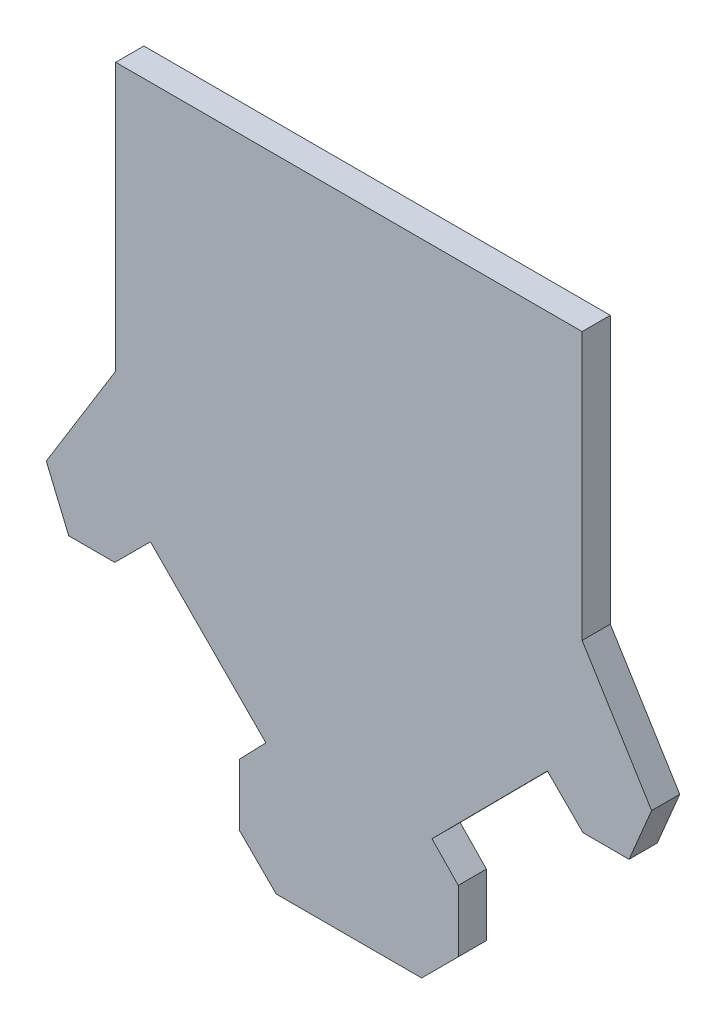
ISO-10303-21;
HEADER;
FILE_DESCRIPTION(('STEP AP214'),'2;1');
FILE_NAME('part.step','',(''),(''),'','','');
FILE_SCHEMA(('AUTOMOTIVE_DESIGN { 1 0 10303 214 1 1 1 1 }'));
ENDSEC;
DATA;
#1=APPLICATION_CONTEXT('core data for automotive mechanical design processes');
#2=APPLICATION_PROTOCOL_DEFINITION('international standard','automotive_design',2000,#1);
#3=PRODUCT_CONTEXT('',#1,'mechanical');
#4=PRODUCT('Part','Part','',(#3));
#5=PRODUCT_RELATED_PRODUCT_CATEGORY('part','',(#4));
#6=PRODUCT_DEFINITION_FORMATION('','',#4);
#7=PRODUCT_DEFINITION_CONTEXT('part definition',#1,'design');
#8=PRODUCT_DEFINITION('design','',#6,#7);
#9=PRODUCT_DEFINITION_SHAPE('','',#8);
#10=(LENGTH_UNIT() NAMED_UNIT(*) SI_UNIT(.MILLI.,.METRE.));
#11=(NAMED_UNIT(*) PLANE_ANGLE_UNIT() SI_UNIT($,.RADIAN.));
#12=(NAMED_UNIT(*) SI_UNIT($,.STERADIAN.) SOLID_ANGLE_UNIT());
#13=UNCERTAINTY_MEASURE_WITH_UNIT(LENGTH_MEASURE(1.E-05),#10,'distance_accuracy_value','');
#14=(GEOMETRIC_REPRESENTATION_CONTEXT(3) GLOBAL_UNCERTAINTY_ASSIGNED_CONTEXT((#13)) GLOBAL_UNIT_ASSIGNED_CONTEXT((#10,
#11,#12)) REPRESENTATION_CONTEXT('',''));
#15=CARTESIAN_POINT('',(0.,0.,0.));
#16=DIRECTION('',(0.,0.,1.));
#17=DIRECTION('',(1.,0.,0.));
#18=AXIS2_PLACEMENT_3D('',#15,#16,#17);
#19=CARTESIAN_POINT('',(49.7,-102.361198886854,3.));
#20=DIRECTION('',(1.,0.,0.));
#21=DIRECTION('',(0.,0.,-1.));
#22=AXIS2_PLACEMENT_3D('',#19,#20,#21);
#23=PLANE('',#22);
#24=DIRECTION('',(0.,-1.,0.));
#25=VECTOR('',#24,1.);
#26=CARTESIAN_POINT('',(49.7,-102.361198886854,0.));
#27=LINE('',#26,#25);
#28=CARTESIAN_POINT('',(49.7,0.,0.));
#29=VERTEX_POINT('',#28);
#30=CARTESIAN_POINT('',(49.7,-28.5,0.));
#31=VERTEX_POINT('',#30);
#32=EDGE_CURVE('E200',#29,#31,#27,.T.);
#33=ORIENTED_EDGE('',*,*,#32,.F.);
#34=DIRECTION('',(0.,0.,-1.));
#35=VECTOR('',#34,1.);
#36=CARTESIAN_POINT('',(49.7,0.,3.));
#37=LINE('',#36,#35);
#38=CARTESIAN_POINT('',(49.7,0.,3.));
#39=VERTEX_POINT('',#38);
#40=EDGE_CURVE('E11',#39,#29,#37,.T.);
#41=ORIENTED_EDGE('',*,*,#40,.F.);
#42=DIRECTION('',(0.,-1.,0.));
#43=VECTOR('',#42,1.);
#44=CARTESIAN_POINT('',(49.7,-102.361198886854,3.));
#45=LINE('',#44,#43);
#46=CARTESIAN_POINT('',(49.7,-28.5,3.));
#47=VERTEX_POINT('',#46);
#48=EDGE_CURVE('E246',#39,#47,#45,.T.);
#49=ORIENTED_EDGE('',*,*,#48,.T.);
#50=DIRECTION('',(0.,0.,-1.));
#51=VECTOR('',#50,1.);
#52=CARTESIAN_POINT('',(49.7,-28.5,3.));
#53=LINE('',#52,#51);
#54=EDGE_CURVE('E50',#47,#31,#53,.T.);
#55=ORIENTED_EDGE('',*,*,#54,.T.);
#56=EDGE_LOOP('',(#33,#41,#49,#55));
#57=FACE_BOUND('',#56,.T.);
#58=ADVANCED_FACE('F34',(#57),#23,.T.);
#59=CARTESIAN_POINT('',(16.2430580145178,0.,3.));
#60=DIRECTION('',(0.,-1.,0.));
#61=DIRECTION('',(0.,0.,-1.));
#62=AXIS2_PLACEMENT_3D('',#59,#60,#61);
#63=PLANE('',#62);
#64=DIRECTION('',(-1.,0.,0.));
#65=VECTOR('',#64,1.);
#66=CARTESIAN_POINT('',(16.2430580145178,0.,0.));
#67=LINE('',#66,#65);
#68=CARTESIAN_POINT('',(0.,0.,0.));
#69=VERTEX_POINT('',#68);
#70=EDGE_CURVE('E202',#29,#69,#67,.T.);
#71=ORIENTED_EDGE('',*,*,#70,.T.);
#72=DIRECTION('',(0.,0.,-1.));
#73=VECTOR('',#72,1.);
#74=CARTESIAN_POINT('',(0.,0.,3.));
#75=LINE('',#74,#73);
#76=CARTESIAN_POINT('',(0.,0.,3.));
#77=VERTEX_POINT('',#76);
#78=EDGE_CURVE('E42',#77,#69,#75,.T.);
#79=ORIENTED_EDGE('',*,*,#78,.F.);
#80=DIRECTION('',(-1.,0.,0.));
#81=VECTOR('',#80,1.);
#82=CARTESIAN_POINT('',(16.2430580145178,0.,3.));
#83=LINE('',#82,#81);
#84=EDGE_CURVE('E574',#39,#77,#83,.T.);
#85=ORIENTED_EDGE('',*,*,#84,.F.);
#86=ORIENTED_EDGE('',*,*,#40,.T.);
#87=EDGE_LOOP('',(#71,#79,#85,#86));
#88=FACE_BOUND('',#87,.T.);
#89=ADVANCED_FACE('F356',(#88),#63,.F.);
#90=CARTESIAN_POINT('',(0.,-102.361198886854,3.));
#91=DIRECTION('',(1.,0.,0.));
#92=DIRECTION('',(0.,1.,0.));
#93=AXIS2_PLACEMENT_3D('',#90,#91,#92);
#94=PLANE('',#93);
#95=DIRECTION('',(0.,-1.,0.));
#96=VECTOR('',#95,1.);
#97=CARTESIAN_POINT('',(0.,-102.361198886854,0.));
#98=LINE('',#97,#96);
#99=CARTESIAN_POINT('',(0.,-28.5,0.));
#100=VERTEX_POINT('',#99);
#101=EDGE_CURVE('E204',#69,#100,#98,.T.);
#102=ORIENTED_EDGE('',*,*,#101,.T.);
#103=DIRECTION('',(0.,0.,-1.));
#104=VECTOR('',#103,1.);
#105=CARTESIAN_POINT('',(0.,-28.5,3.));
#106=LINE('',#105,#104);
#107=CARTESIAN_POINT('',(0.,-28.5,3.));
#108=VERTEX_POINT('',#107);
#109=EDGE_CURVE('E284',#108,#100,#106,.T.);
#110=ORIENTED_EDGE('',*,*,#109,.F.);
#111=DIRECTION('',(0.,-1.,0.));
#112=VECTOR('',#111,1.);
#113=CARTESIAN_POINT('',(0.,-102.361198886854,3.));
#114=LINE('',#113,#112);
#115=EDGE_CURVE('E293',#77,#108,#114,.T.);
#116=ORIENTED_EDGE('',*,*,#115,.F.);
#117=ORIENTED_EDGE('',*,*,#78,.T.);
#118=EDGE_LOOP('',(#102,#110,#116,#117));
#119=FACE_BOUND('',#118,.T.);
#120=ADVANCED_FACE('F291',(#119),#94,.F.);
#121=CARTESIAN_POINT('',(-28.5238710217228,-74.754925981172,3.));
#122=DIRECTION('',(0.85117086972399,-0.52488870299646,0.));
#123=DIRECTION('',(0.52488870299646,0.85117086972399,0.));
#124=AXIS2_PLACEMENT_3D('',#121,#122,#123);
#125=PLANE('',#124);
#126=DIRECTION('',(-0.524888702996461,-0.85117086972399,0.));
#127=VECTOR('',#126,1.);
#128=CARTESIAN_POINT('',(-28.5238710217228,-74.754925981172,0.));
#129=LINE('',#128,#127);
#130=CARTESIAN_POINT('',(-7.4,-40.5,0.));
#131=VERTEX_POINT('',#130);
#132=EDGE_CURVE('E206',#100,#131,#129,.T.);
#133=ORIENTED_EDGE('',*,*,#132,.T.);
#134=DIRECTION('',(0.,0.,-1.));
#135=VECTOR('',#134,1.);
#136=CARTESIAN_POINT('',(-7.4,-40.5,3.));
#137=LINE('',#136,#135);
#138=CARTESIAN_POINT('',(-7.4,-40.5,3.));
#139=VERTEX_POINT('',#138);
#140=EDGE_CURVE('E281',#139,#131,#137,.T.);
#141=ORIENTED_EDGE('',*,*,#140,.F.);
#142=DIRECTION('',(-0.524888702996461,-0.85117086972399,0.));
#143=VECTOR('',#142,1.);
#144=CARTESIAN_POINT('',(-28.5238710217228,-74.754925981172,3.));
#145=LINE('',#144,#143);
#146=EDGE_CURVE('E312',#108,#139,#145,.T.);
#147=ORIENTED_EDGE('',*,*,#146,.F.);
#148=ORIENTED_EDGE('',*,*,#109,.T.);
#149=EDGE_LOOP('',(#133,#141,#147,#148));
#150=FACE_BOUND('',#149,.T.);
#151=ADVANCED_FACE('F303',(#150),#125,.F.);
#152=CARTESIAN_POINT('',(18.2848422205433,-101.50150027379,3.));
#153=DIRECTION('',(0.921635375138065,0.388057000058133,0.));
#154=DIRECTION('',(-0.388057000058133,0.921635375138065,0.));
#155=AXIS2_PLACEMENT_3D('',#152,#153,#154);
#156=PLANE('',#155);
#157=DIRECTION('',(0.388057000058133,-0.921635375138065,0.));
#158=VECTOR('',#157,1.);
#159=CARTESIAN_POINT('',(18.2848422205433,-101.50150027379,0.));
#160=LINE('',#159,#158);
#161=CARTESIAN_POINT('',(-4.99999999999999,-46.2,0.));
#162=VERTEX_POINT('',#161);
#163=EDGE_CURVE('E208',#131,#162,#160,.T.);
#164=ORIENTED_EDGE('',*,*,#163,.T.);
#165=DIRECTION('',(0.,0.,-1.));
#166=VECTOR('',#165,1.);
#167=CARTESIAN_POINT('',(-4.99999999999999,-46.2,3.));
#168=LINE('',#167,#166);
#169=CARTESIAN_POINT('',(-4.99999999999999,-46.2,3.));
#170=VERTEX_POINT('',#169);
#171=EDGE_CURVE('E278',#170,#162,#168,.T.);
#172=ORIENTED_EDGE('',*,*,#171,.F.);
#173=DIRECTION('',(0.388057000058133,-0.921635375138065,0.));
#174=VECTOR('',#173,1.);
#175=CARTESIAN_POINT('',(18.2848422205433,-101.50150027379,3.));
#176=LINE('',#175,#174);
#177=EDGE_CURVE('E309',#139,#170,#176,.T.);
#178=ORIENTED_EDGE('',*,*,#177,.F.);
#179=ORIENTED_EDGE('',*,*,#140,.T.);
#180=EDGE_LOOP('',(#164,#172,#178,#179));
#181=FACE_BOUND('',#180,.T.);
#182=ADVANCED_FACE('F307',(#181),#156,.F.);
#183=CARTESIAN_POINT('',(16.2430580145178,-46.2,3.));
#184=DIRECTION('',(0.,1.,0.));
#185=DIRECTION('',(0.,0.,1.));
#186=AXIS2_PLACEMENT_3D('',#183,#184,#185);
#187=PLANE('',#186);
#188=DIRECTION('',(1.,0.,0.));
#189=VECTOR('',#188,1.);
#190=CARTESIAN_POINT('',(16.2430580145178,-46.2,0.));
#191=LINE('',#190,#189);
#192=CARTESIAN_POINT('',(-0.0999999999999959,-46.2,0.));
#193=VERTEX_POINT('',#192);
#194=EDGE_CURVE('E210',#162,#193,#191,.T.);
#195=ORIENTED_EDGE('',*,*,#194,.T.);
#196=DIRECTION('',(0.,0.,-1.));
#197=VECTOR('',#196,1.);
#198=CARTESIAN_POINT('',(-0.0999999999999959,-46.2,3.));
#199=LINE('',#198,#197);
#200=CARTESIAN_POINT('',(-0.0999999999999959,-46.2,3.));
#201=VERTEX_POINT('',#200);
#202=EDGE_CURVE('E275',#201,#193,#199,.T.);
#203=ORIENTED_EDGE('',*,*,#202,.F.);
#204=DIRECTION('',(1.,0.,0.));
#205=VECTOR('',#204,1.);
#206=CARTESIAN_POINT('',(16.2430580145178,-46.2,3.));
#207=LINE('',#206,#205);
#208=EDGE_CURVE('E311',#170,#201,#207,.T.);
#209=ORIENTED_EDGE('',*,*,#208,.F.);
#210=ORIENTED_EDGE('',*,*,#171,.T.);
#211=EDGE_LOOP('',(#195,#203,#209,#210));
#212=FACE_BOUND('',#211,.T.);
#213=ADVANCED_FACE('F369',(#212),#187,.F.);
#214=CARTESIAN_POINT('',(-20.0090704361679,-66.1090704361679,3.));
#215=DIRECTION('',(-0.707106781186547,0.707106781186548,0.));
#216=DIRECTION('',(-0.707106781186548,-0.707106781186547,0.));
#217=AXIS2_PLACEMENT_3D('',#214,#215,#216);
#218=PLANE('',#217);
#219=DIRECTION('',(0.707106781186548,0.707106781186547,0.));
#220=VECTOR('',#219,1.);
#221=CARTESIAN_POINT('',(-20.0090704361679,-66.1090704361679,0.));
#222=LINE('',#221,#220);
#223=CARTESIAN_POINT('',(3.7,-42.4,0.));
#224=VERTEX_POINT('',#223);
#225=EDGE_CURVE('E212',#193,#224,#222,.T.);
#226=ORIENTED_EDGE('',*,*,#225,.T.);
#227=DIRECTION('',(0.,0.,-1.));
#228=VECTOR('',#227,1.);
#229=CARTESIAN_POINT('',(3.7,-42.4,3.));
#230=LINE('',#229,#228);
#231=CARTESIAN_POINT('',(3.7,-42.4,3.));
#232=VERTEX_POINT('',#231);
#233=EDGE_CURVE('E272',#232,#224,#230,.T.);
#234=ORIENTED_EDGE('',*,*,#233,.F.);
#235=DIRECTION('',(0.707106781186548,0.707106781186547,0.));
#236=VECTOR('',#235,1.);
#237=CARTESIAN_POINT('',(-20.0090704361679,-66.1090704361679,3.));
#238=LINE('',#237,#236);
#239=EDGE_CURVE('E314',#201,#232,#238,.T.);
#240=ORIENTED_EDGE('',*,*,#239,.F.);
#241=ORIENTED_EDGE('',*,*,#202,.T.);
#242=EDGE_LOOP('',(#226,#234,#240,#241));
#243=FACE_BOUND('',#242,.T.);
#244=ADVANCED_FACE('F372',(#243),#218,.F.);
#245=CARTESIAN_POINT('',(39.9003648622827,-78.8946767717321,3.));
#246=DIRECTION('',(0.70996374318455,0.704238229126609,0.));
#247=DIRECTION('',(-0.704238229126609,0.70996374318455,0.));
#248=AXIS2_PLACEMENT_3D('',#245,#246,#247);
#249=PLANE('',#248);
#250=DIRECTION('',(0.704238229126609,-0.70996374318455,0.));
#251=VECTOR('',#250,1.);
#252=CARTESIAN_POINT('',(39.9003648622827,-78.8946767717321,0.));
#253=LINE('',#252,#251);
#254=CARTESIAN_POINT('',(16.,-54.8,0.));
#255=VERTEX_POINT('',#254);
#256=EDGE_CURVE('E214',#224,#255,#253,.T.);
#257=ORIENTED_EDGE('',*,*,#256,.T.);
#258=DIRECTION('',(0.,0.,-1.));
#259=VECTOR('',#258,1.);
#260=CARTESIAN_POINT('',(16.,-54.8,3.));
#261=LINE('',#260,#259);
#262=CARTESIAN_POINT('',(16.,-54.8,3.));
#263=VERTEX_POINT('',#262);
#264=EDGE_CURVE('E269',#263,#255,#261,.T.);
#265=ORIENTED_EDGE('',*,*,#264,.F.);
#266=DIRECTION('',(0.704238229126609,-0.70996374318455,0.));
#267=VECTOR('',#266,1.);
#268=CARTESIAN_POINT('',(39.9003648622827,-78.8946767717321,3.));
#269=LINE('',#268,#267);
#270=EDGE_CURVE('E320',#232,#263,#269,.T.);
#271=ORIENTED_EDGE('',*,*,#270,.F.);
#272=ORIENTED_EDGE('',*,*,#233,.T.);
#273=EDGE_LOOP('',(#257,#265,#271,#272));
#274=FACE_BOUND('',#273,.T.);
#275=ADVANCED_FACE('F376',(#274),#249,.F.);
#276=CARTESIAN_POINT('',(-7.64869908476506,-79.2932954806495,3.));
#277=DIRECTION('',(0.719401460617409,-0.694594513699567,0.));
#278=DIRECTION('',(0.694594513699567,0.719401460617409,0.));
#279=AXIS2_PLACEMENT_3D('',#276,#277,#278);
#280=PLANE('',#279);
#281=DIRECTION('',(-0.694594513699567,-0.719401460617409,0.));
#282=VECTOR('',#281,1.);
#283=CARTESIAN_POINT('',(-7.64869908476506,-79.2932954806495,0.));
#284=LINE('',#283,#282);
#285=CARTESIAN_POINT('',(13.2,-57.7,0.));
#286=VERTEX_POINT('',#285);
#287=EDGE_CURVE('E216',#255,#286,#284,.T.);
#288=ORIENTED_EDGE('',*,*,#287,.T.);
#289=DIRECTION('',(0.,0.,-1.));
#290=VECTOR('',#289,1.);
#291=CARTESIAN_POINT('',(13.2,-57.7,3.));
#292=LINE('',#291,#290);
#293=CARTESIAN_POINT('',(13.2,-57.7,3.));
#294=VERTEX_POINT('',#293);
#295=EDGE_CURVE('E266',#294,#286,#292,.T.);
#296=ORIENTED_EDGE('',*,*,#295,.F.);
#297=DIRECTION('',(-0.694594513699567,-0.719401460617409,0.));
#298=VECTOR('',#297,1.);
#299=CARTESIAN_POINT('',(-7.64869908476506,-79.2932954806495,3.));
#300=LINE('',#299,#298);
#301=EDGE_CURVE('E322',#263,#294,#300,.T.);
#302=ORIENTED_EDGE('',*,*,#301,.F.);
#303=ORIENTED_EDGE('',*,*,#264,.T.);
#304=EDGE_LOOP('',(#288,#296,#302,#303));
#305=FACE_BOUND('',#304,.T.);
#306=ADVANCED_FACE('F380',(#305),#280,.F.);
#307=CARTESIAN_POINT('',(13.2,-102.361198886854,3.));
#308=DIRECTION('',(1.,0.,0.));
#309=DIRECTION('',(0.,0.,-1.));
#310=AXIS2_PLACEMENT_3D('',#307,#308,#309);
#311=PLANE('',#310);
#312=DIRECTION('',(0.,-1.,0.));
#313=VECTOR('',#312,1.);
#314=CARTESIAN_POINT('',(13.2,-102.361198886854,0.));
#315=LINE('',#314,#313);
#316=CARTESIAN_POINT('',(13.2,-64.3,0.));
#317=VERTEX_POINT('',#316);
#318=EDGE_CURVE('E218',#286,#317,#315,.T.);
#319=ORIENTED_EDGE('',*,*,#318,.T.);
#320=DIRECTION('',(0.,0.,-1.));
#321=VECTOR('',#320,1.);
#322=CARTESIAN_POINT('',(13.2,-64.3,3.));
#323=LINE('',#322,#321);
#324=CARTESIAN_POINT('',(13.2,-64.3,3.));
#325=VERTEX_POINT('',#324);
#326=EDGE_CURVE('E263',#325,#317,#323,.T.);
#327=ORIENTED_EDGE('',*,*,#326,.F.);
#328=DIRECTION('',(0.,-1.,0.));
#329=VECTOR('',#328,1.);
#330=CARTESIAN_POINT('',(13.2,-102.361198886854,3.));
#331=LINE('',#330,#329);
#332=EDGE_CURVE('E324',#294,#325,#331,.T.);
#333=ORIENTED_EDGE('',*,*,#332,.F.);
#334=ORIENTED_EDGE('',*,*,#295,.T.);
#335=EDGE_LOOP('',(#319,#327,#333,#334));
#336=FACE_BOUND('',#335,.T.);
#337=ADVANCED_FACE('F384',(#336),#311,.F.);
#338=CARTESIAN_POINT('',(33.7521284506858,-84.8521284506858,3.));
#339=DIRECTION('',(0.707106781186547,0.707106781186547,0.));
#340=DIRECTION('',(-0.707106781186548,0.707106781186548,0.));
#341=AXIS2_PLACEMENT_3D('',#338,#339,#340);
#342=PLANE('',#341);
#343=DIRECTION('',(0.707106781186548,-0.707106781186548,0.));
#344=VECTOR('',#343,1.);
#345=CARTESIAN_POINT('',(33.7521284506858,-84.8521284506858,0.));
#346=LINE('',#345,#344);
#347=CARTESIAN_POINT('',(17.1,-68.2,0.));
#348=VERTEX_POINT('',#347);
#349=EDGE_CURVE('E220',#317,#348,#346,.T.);
#350=ORIENTED_EDGE('',*,*,#349,.T.);
#351=DIRECTION('',(0.,0.,-1.));
#352=VECTOR('',#351,1.);
#353=CARTESIAN_POINT('',(17.1,-68.2,3.));
#354=LINE('',#353,#352);
#355=CARTESIAN_POINT('',(17.1,-68.2,3.));
#356=VERTEX_POINT('',#355);
#357=EDGE_CURVE('E260',#356,#348,#354,.T.);
#358=ORIENTED_EDGE('',*,*,#357,.F.);
#359=DIRECTION('',(0.707106781186548,-0.707106781186548,0.));
#360=VECTOR('',#359,1.);
#361=CARTESIAN_POINT('',(33.7521284506858,-84.8521284506858,3.));
#362=LINE('',#361,#360);
#363=EDGE_CURVE('E326',#325,#356,#362,.T.);
#364=ORIENTED_EDGE('',*,*,#363,.F.);
#365=ORIENTED_EDGE('',*,*,#326,.T.);
#366=EDGE_LOOP('',(#350,#358,#364,#365));
#367=FACE_BOUND('',#366,.T.);
#368=ADVANCED_FACE('F388',(#367),#342,.F.);
#369=CARTESIAN_POINT('',(16.2430580145178,-68.2,3.));
#370=DIRECTION('',(0.,1.,0.));
#371=DIRECTION('',(0.,0.,1.));
#372=AXIS2_PLACEMENT_3D('',#369,#370,#371);
#373=PLANE('',#372);
#374=DIRECTION('',(1.,0.,0.));
#375=VECTOR('',#374,1.);
#376=CARTESIAN_POINT('',(16.2430580145178,-68.2,0.));
#377=LINE('',#376,#375);
#378=CARTESIAN_POINT('',(32.6,-68.2,0.));
#379=VERTEX_POINT('',#378);
#380=EDGE_CURVE('E222',#348,#379,#377,.T.);
#381=ORIENTED_EDGE('',*,*,#380,.T.);
#382=DIRECTION('',(0.,0.,-1.));
#383=VECTOR('',#382,1.);
#384=CARTESIAN_POINT('',(32.6,-68.2,3.));
#385=LINE('',#384,#383);
#386=CARTESIAN_POINT('',(32.6,-68.2,3.));
#387=VERTEX_POINT('',#386);
#388=EDGE_CURVE('E258',#387,#379,#385,.T.);
#389=ORIENTED_EDGE('',*,*,#388,.F.);
#390=DIRECTION('',(1.,0.,0.));
#391=VECTOR('',#390,1.);
#392=CARTESIAN_POINT('',(16.2430580145178,-68.2,3.));
#393=LINE('',#392,#391);
#394=EDGE_CURVE('E328',#356,#387,#393,.T.);
#395=ORIENTED_EDGE('',*,*,#394,.F.);
#396=ORIENTED_EDGE('',*,*,#357,.T.);
#397=EDGE_LOOP('',(#381,#389,#395,#396));
#398=FACE_BOUND('',#397,.T.);
#399=ADVANCED_FACE('F392',(#398),#373,.F.);
#400=CARTESIAN_POINT('',(7.34092956383207,-93.4590704361679,3.));
#401=DIRECTION('',(0.707106781186547,-0.707106781186547,0.));
#402=DIRECTION('',(0.707106781186548,0.707106781186548,0.));
#403=AXIS2_PLACEMENT_3D('',#400,#401,#402);
#404=PLANE('',#403);
#405=DIRECTION('',(-0.707106781186548,-0.707106781186548,0.));
#406=VECTOR('',#405,1.);
#407=CARTESIAN_POINT('',(7.34092956383207,-93.4590704361679,0.));
#408=LINE('',#407,#406);
#409=CARTESIAN_POINT('',(36.5,-64.3,0.));
#410=VERTEX_POINT('',#409);
#411=EDGE_CURVE('E225',#410,#379,#408,.T.);
#412=ORIENTED_EDGE('',*,*,#411,.F.);
#413=DIRECTION('',(0.,0.,-1.));
#414=VECTOR('',#413,1.);
#415=CARTESIAN_POINT('',(36.5,-64.3,3.));
#416=LINE('',#415,#414);
#417=CARTESIAN_POINT('',(36.5,-64.3,3.));
#418=VERTEX_POINT('',#417);
#419=EDGE_CURVE('E256',#418,#410,#416,.T.);
#420=ORIENTED_EDGE('',*,*,#419,.F.);
#421=DIRECTION('',(-0.707106781186548,-0.707106781186548,0.));
#422=VECTOR('',#421,1.);
#423=CARTESIAN_POINT('',(7.34092956383207,-93.4590704361679,3.));
#424=LINE('',#423,#422);
#425=EDGE_CURVE('E330',#418,#387,#424,.T.);
#426=ORIENTED_EDGE('',*,*,#425,.T.);
#427=ORIENTED_EDGE('',*,*,#388,.T.);
#428=EDGE_LOOP('',(#412,#420,#426,#427));
#429=FACE_BOUND('',#428,.T.);
#430=ADVANCED_FACE('F396',(#429),#404,.T.);
#431=CARTESIAN_POINT('',(36.5,-102.361198886854,3.));
#432=DIRECTION('',(1.,0.,0.));
#433=DIRECTION('',(0.,0.,-1.));
#434=AXIS2_PLACEMENT_3D('',#431,#432,#433);
#435=PLANE('',#434);
#436=DIRECTION('',(0.,-1.,0.));
#437=VECTOR('',#436,1.);
#438=CARTESIAN_POINT('',(36.5,-102.361198886854,0.));
#439=LINE('',#438,#437);
#440=CARTESIAN_POINT('',(36.5,-57.7,0.));
#441=VERTEX_POINT('',#440);
#442=EDGE_CURVE('E228',#441,#410,#439,.T.);
#443=ORIENTED_EDGE('',*,*,#442,.F.);
#444=DIRECTION('',(0.,0.,-1.));
#445=VECTOR('',#444,1.);
#446=CARTESIAN_POINT('',(36.5,-57.7,3.));
#447=LINE('',#446,#445);
#448=CARTESIAN_POINT('',(36.5,-57.7,3.));
#449=VERTEX_POINT('',#448);
#450=EDGE_CURVE('E254',#449,#441,#447,.T.);
#451=ORIENTED_EDGE('',*,*,#450,.F.);
#452=DIRECTION('',(0.,-1.,0.));
#453=VECTOR('',#452,1.);
#454=CARTESIAN_POINT('',(36.5,-102.361198886854,3.));
#455=LINE('',#454,#453);
#456=EDGE_CURVE('E333',#449,#418,#455,.T.);
#457=ORIENTED_EDGE('',*,*,#456,.T.);
#458=ORIENTED_EDGE('',*,*,#419,.T.);
#459=EDGE_LOOP('',(#443,#451,#457,#458));
#460=FACE_BOUND('',#459,.T.);
#461=ADVANCED_FACE('F400',(#460),#435,.T.);
#462=CARTESIAN_POINT('',(49.0436621412352,-70.6916500748507,3.));
#463=DIRECTION('',(0.719401460617409,0.694594513699568,0.));
#464=DIRECTION('',(-0.694594513699568,0.719401460617409,0.));
#465=AXIS2_PLACEMENT_3D('',#462,#463,#464);
#466=PLANE('',#465);
#467=DIRECTION('',(0.694594513699568,-0.719401460617409,0.));
#468=VECTOR('',#467,1.);
#469=CARTESIAN_POINT('',(49.0436621412352,-70.6916500748507,0.));
#470=LINE('',#469,#468);
#471=CARTESIAN_POINT('',(33.7,-54.8,0.));
#472=VERTEX_POINT('',#471);
#473=EDGE_CURVE('E231',#472,#441,#470,.T.);
#474=ORIENTED_EDGE('',*,*,#473,.F.);
#475=DIRECTION('',(0.,0.,-1.));
#476=VECTOR('',#475,1.);
#477=CARTESIAN_POINT('',(33.7,-54.8,3.));
#478=LINE('',#477,#476);
#479=CARTESIAN_POINT('',(33.7,-54.8,3.));
#480=VERTEX_POINT('',#479);
#481=EDGE_CURVE('E252',#480,#472,#478,.T.);
#482=ORIENTED_EDGE('',*,*,#481,.F.);
#483=DIRECTION('',(0.694594513699568,-0.719401460617409,0.));
#484=VECTOR('',#483,1.);
#485=CARTESIAN_POINT('',(49.0436621412352,-70.6916500748507,3.));
#486=LINE('',#485,#484);
#487=EDGE_CURVE('E336',#480,#449,#486,.T.);
#488=ORIENTED_EDGE('',*,*,#487,.T.);
#489=ORIENTED_EDGE('',*,*,#450,.T.);
#490=EDGE_LOOP('',(#474,#482,#488,#489));
#491=FACE_BOUND('',#490,.T.);
#492=ADVANCED_FACE('F404',(#491),#466,.T.);
#493=CARTESIAN_POINT('',(1.2623838478724,-87.501336608649,3.));
#494=DIRECTION('',(0.70996374318455,-0.704238229126609,0.));
#495=DIRECTION('',(0.704238229126609,0.70996374318455,0.));
#496=AXIS2_PLACEMENT_3D('',#493,#494,#495);
#497=PLANE('',#496);
#498=DIRECTION('',(-0.704238229126609,-0.70996374318455,0.));
#499=VECTOR('',#498,1.);
#500=CARTESIAN_POINT('',(1.2623838478724,-87.501336608649,0.));
#501=LINE('',#500,#499);
#502=CARTESIAN_POINT('',(46.,-42.4,0.));
#503=VERTEX_POINT('',#502);
#504=EDGE_CURVE('E234',#503,#472,#501,.T.);
#505=ORIENTED_EDGE('',*,*,#504,.F.);
#506=DIRECTION('',(0.,0.,-1.));
#507=VECTOR('',#506,1.);
#508=CARTESIAN_POINT('',(46.,-42.4,3.));
#509=LINE('',#508,#507);
#510=CARTESIAN_POINT('',(46.,-42.4,3.));
#511=VERTEX_POINT('',#510);
#512=EDGE_CURVE('E250',#511,#503,#509,.T.);
#513=ORIENTED_EDGE('',*,*,#512,.F.);
#514=DIRECTION('',(-0.704238229126609,-0.70996374318455,0.));
#515=VECTOR('',#514,1.);
#516=CARTESIAN_POINT('',(1.2623838478724,-87.501336608649,3.));
#517=LINE('',#516,#515);
#518=EDGE_CURVE('E339',#511,#480,#517,.T.);
#519=ORIENTED_EDGE('',*,*,#518,.T.);
#520=ORIENTED_EDGE('',*,*,#481,.T.);
#521=EDGE_LOOP('',(#505,#513,#519,#520));
#522=FACE_BOUND('',#521,.T.);
#523=ADVANCED_FACE('F408',(#522),#497,.T.);
#524=CARTESIAN_POINT('',(61.1021284506857,-57.5021284506857,3.));
#525=DIRECTION('',(-0.707106781186547,-0.707106781186548,0.));
#526=DIRECTION('',(0.707106781186548,-0.707106781186547,0.));
#527=AXIS2_PLACEMENT_3D('',#524,#525,#526);
#528=PLANE('',#527);
#529=DIRECTION('',(-0.707106781186548,0.707106781186547,0.));
#530=VECTOR('',#529,1.);
#531=CARTESIAN_POINT('',(61.1021284506857,-57.5021284506857,0.));
#532=LINE('',#531,#530);
#533=CARTESIAN_POINT('',(49.8,-46.2,0.));
#534=VERTEX_POINT('',#533);
#535=EDGE_CURVE('E237',#534,#503,#532,.T.);
#536=ORIENTED_EDGE('',*,*,#535,.F.);
#537=DIRECTION('',(0.,0.,-1.));
#538=VECTOR('',#537,1.);
#539=CARTESIAN_POINT('',(49.8,-46.2,3.));
#540=LINE('',#539,#538);
#541=CARTESIAN_POINT('',(49.8,-46.2,3.));
#542=VERTEX_POINT('',#541);
#543=EDGE_CURVE('E181',#542,#534,#540,.T.);
#544=ORIENTED_EDGE('',*,*,#543,.F.);
#545=DIRECTION('',(-0.707106781186548,0.707106781186547,0.));
#546=VECTOR('',#545,1.);
#547=CARTESIAN_POINT('',(61.1021284506857,-57.5021284506857,3.));
#548=LINE('',#547,#546);
#549=EDGE_CURVE('E192',#542,#511,#548,.T.);
#550=ORIENTED_EDGE('',*,*,#549,.T.);
#551=ORIENTED_EDGE('',*,*,#512,.T.);
#552=EDGE_LOOP('',(#536,#544,#550,#551));
#553=FACE_BOUND('',#552,.T.);
#554=ADVANCED_FACE('F343',(#553),#528,.T.);
#555=CARTESIAN_POINT('',(16.2430580145178,-46.2,3.));
#556=DIRECTION('',(0.,-1.,0.));
#557=DIRECTION('',(0.,0.,-1.));
#558=AXIS2_PLACEMENT_3D('',#555,#556,#557);
#559=PLANE('',#558);
#560=DIRECTION('',(-1.,0.,0.));
#561=VECTOR('',#560,1.);
#562=CARTESIAN_POINT('',(16.2430580145178,-46.2,0.));
#563=LINE('',#562,#561);
#564=CARTESIAN_POINT('',(54.7,-46.2,0.));
#565=VERTEX_POINT('',#564);
#566=EDGE_CURVE('E177',#565,#534,#563,.T.);
#567=ORIENTED_EDGE('',*,*,#566,.F.);
#568=DIRECTION('',(0.,0.,-1.));
#569=VECTOR('',#568,1.);
#570=CARTESIAN_POINT('',(54.7,-46.2,3.));
#571=LINE('',#570,#569);
#572=CARTESIAN_POINT('',(54.7,-46.2,3.));
#573=VERTEX_POINT('',#572);
#574=EDGE_CURVE('E172',#573,#565,#571,.T.);
#575=ORIENTED_EDGE('',*,*,#574,.F.);
#576=DIRECTION('',(-1.,0.,0.));
#577=VECTOR('',#576,1.);
#578=CARTESIAN_POINT('',(16.2430580145178,-46.2,3.));
#579=LINE('',#578,#577);
#580=EDGE_CURVE('E175',#573,#542,#579,.T.);
#581=ORIENTED_EDGE('',*,*,#580,.T.);
#582=ORIENTED_EDGE('',*,*,#543,.T.);
#583=EDGE_LOOP('',(#567,#575,#581,#582));
#584=FACE_BOUND('',#583,.T.);
#585=ADVANCED_FACE('F174',(#584),#559,.T.);
#586=CARTESIAN_POINT('',(28.8229493697115,-107.657995246935,3.));
#587=DIRECTION('',(0.921635375138065,-0.388057000058132,0.));
#588=DIRECTION('',(0.388057000058133,0.921635375138065,0.));
#589=AXIS2_PLACEMENT_3D('',#586,#587,#588);
#590=PLANE('',#589);
#591=DIRECTION('',(-0.388057000058132,-0.921635375138065,0.));
#592=VECTOR('',#591,1.);
#593=CARTESIAN_POINT('',(28.8229493697115,-107.657995246935,0.));
#594=LINE('',#593,#592);
#595=CARTESIAN_POINT('',(57.1,-40.5,0.));
#596=VERTEX_POINT('',#595);
#597=EDGE_CURVE('E241',#596,#565,#594,.T.);
#598=ORIENTED_EDGE('',*,*,#597,.F.);
#599=DIRECTION('',(0.,0.,-1.));
#600=VECTOR('',#599,1.);
#601=CARTESIAN_POINT('',(57.1,-40.5,3.));
#602=LINE('',#601,#600);
#603=CARTESIAN_POINT('',(57.1,-40.5,3.));
#604=VERTEX_POINT('',#603);
#605=EDGE_CURVE('E111',#604,#596,#602,.T.);
#606=ORIENTED_EDGE('',*,*,#605,.F.);
#607=DIRECTION('',(-0.388057000058132,-0.921635375138065,0.));
#608=VECTOR('',#607,1.);
#609=CARTESIAN_POINT('',(28.8229493697115,-107.657995246935,3.));
#610=LINE('',#609,#608);
#611=EDGE_CURVE('E189',#604,#573,#610,.T.);
#612=ORIENTED_EDGE('',*,*,#611,.T.);
#613=ORIENTED_EDGE('',*,*,#574,.T.);
#614=EDGE_LOOP('',(#598,#606,#612,#613));
#615=FACE_BOUND('',#614,.T.);
#616=ADVANCED_FACE('F194',(#615),#590,.T.);
#617=CARTESIAN_POINT('',(73.4813056853874,-67.0642794898175,3.));
#618=DIRECTION('',(0.85117086972399,0.52488870299646,0.));
#619=DIRECTION('',(-0.52488870299646,0.85117086972399,0.));
#620=AXIS2_PLACEMENT_3D('',#617,#618,#619);
#621=PLANE('',#620);
#622=DIRECTION('',(0.52488870299646,-0.85117086972399,0.));
#623=VECTOR('',#622,1.);
#624=CARTESIAN_POINT('',(73.4813056853874,-67.0642794898175,0.));
#625=LINE('',#624,#623);
#626=EDGE_CURVE('E243',#31,#596,#625,.T.);
#627=ORIENTED_EDGE('',*,*,#626,.F.);
#628=ORIENTED_EDGE('',*,*,#54,.F.);
#629=DIRECTION('',(0.52488870299646,-0.85117086972399,0.));
#630=VECTOR('',#629,1.);
#631=CARTESIAN_POINT('',(73.4813056853874,-67.0642794898175,3.));
#632=LINE('',#631,#630);
#633=EDGE_CURVE('E195',#47,#604,#632,.T.);
#634=ORIENTED_EDGE('',*,*,#633,.T.);
#635=ORIENTED_EDGE('',*,*,#605,.T.);
#636=EDGE_LOOP('',(#627,#628,#634,#635));
#637=FACE_BOUND('',#636,.T.);
#638=ADVANCED_FACE('F345',(#637),#621,.T.);
#639=CARTESIAN_POINT('',(16.2430580145178,-102.361198886854,3.));
#640=DIRECTION('',(0.,0.,1.));
#641=DIRECTION('',(1.,0.,0.));
#642=AXIS2_PLACEMENT_3D('',#639,#640,#641);
#643=PLANE('',#642);
#644=ORIENTED_EDGE('',*,*,#48,.F.);
#645=ORIENTED_EDGE('',*,*,#84,.T.);
#646=ORIENTED_EDGE('',*,*,#115,.T.);
#647=ORIENTED_EDGE('',*,*,#146,.T.);
#648=ORIENTED_EDGE('',*,*,#177,.T.);
#649=ORIENTED_EDGE('',*,*,#208,.T.);
#650=ORIENTED_EDGE('',*,*,#239,.T.);
#651=ORIENTED_EDGE('',*,*,#270,.T.);
#652=ORIENTED_EDGE('',*,*,#301,.T.);
#653=ORIENTED_EDGE('',*,*,#332,.T.);
#654=ORIENTED_EDGE('',*,*,#363,.T.);
#655=ORIENTED_EDGE('',*,*,#394,.T.);
#656=ORIENTED_EDGE('',*,*,#425,.F.);
#657=ORIENTED_EDGE('',*,*,#456,.F.);
#658=ORIENTED_EDGE('',*,*,#487,.F.);
#659=ORIENTED_EDGE('',*,*,#518,.F.);
#660=ORIENTED_EDGE('',*,*,#549,.F.);
#661=ORIENTED_EDGE('',*,*,#580,.F.);
#662=ORIENTED_EDGE('',*,*,#611,.F.);
#663=ORIENTED_EDGE('',*,*,#633,.F.);
#664=EDGE_LOOP('',(#644,#645,#646,#647,#648,#649,#650,#651,#652,#653,#654,#655,#656,#657,#658,
#659,#660,#661,#662,#663));
#665=FACE_BOUND('',#664,.T.);
#666=ADVANCED_FACE('F187',(#665),#643,.T.);
#667=CARTESIAN_POINT('',(16.2430580145178,-102.361198886854,0.));
#668=DIRECTION('',(0.,0.,1.));
#669=DIRECTION('',(1.,0.,0.));
#670=AXIS2_PLACEMENT_3D('',#667,#668,#669);
#671=PLANE('',#670);
#672=ORIENTED_EDGE('',*,*,#32,.T.);
#673=ORIENTED_EDGE('',*,*,#626,.T.);
#674=ORIENTED_EDGE('',*,*,#597,.T.);
#675=ORIENTED_EDGE('',*,*,#566,.T.);
#676=ORIENTED_EDGE('',*,*,#535,.T.);
#677=ORIENTED_EDGE('',*,*,#504,.T.);
#678=ORIENTED_EDGE('',*,*,#473,.T.);
#679=ORIENTED_EDGE('',*,*,#442,.T.);
#680=ORIENTED_EDGE('',*,*,#411,.T.);
#681=ORIENTED_EDGE('',*,*,#380,.F.);
#682=ORIENTED_EDGE('',*,*,#349,.F.);
#683=ORIENTED_EDGE('',*,*,#318,.F.);
#684=ORIENTED_EDGE('',*,*,#287,.F.);
#685=ORIENTED_EDGE('',*,*,#256,.F.);
#686=ORIENTED_EDGE('',*,*,#225,.F.);
#687=ORIENTED_EDGE('',*,*,#194,.F.);
#688=ORIENTED_EDGE('',*,*,#163,.F.);
#689=ORIENTED_EDGE('',*,*,#132,.F.);
#690=ORIENTED_EDGE('',*,*,#101,.F.);
#691=ORIENTED_EDGE('',*,*,#70,.F.);
#692=EDGE_LOOP('',(#672,#673,#674,#675,#676,#677,#678,#679,#680,#681,#682,#683,#684,#685,#686,
#687,#688,#689,#690,#691));
#693=FACE_BOUND('',#692,.T.);
#694=ADVANCED_FACE('F298',(#693),#671,.F.);
#695=CLOSED_SHELL('',(#58,#89,#120,#151,#182,#213,#244,#275,#306,#337,#368,#399,#430,#461,#492,
#523,#554,#585,#616,#638,#666,#694));
#696=MANIFOLD_SOLID_BREP('B2',#695);
#697=ADVANCED_BREP_SHAPE_REPRESENTATION('',(#18,#696),#14);
#698=SHAPE_DEFINITION_REPRESENTATION(#9,#697);
ENDSEC;
END-ISO-10303-21;
